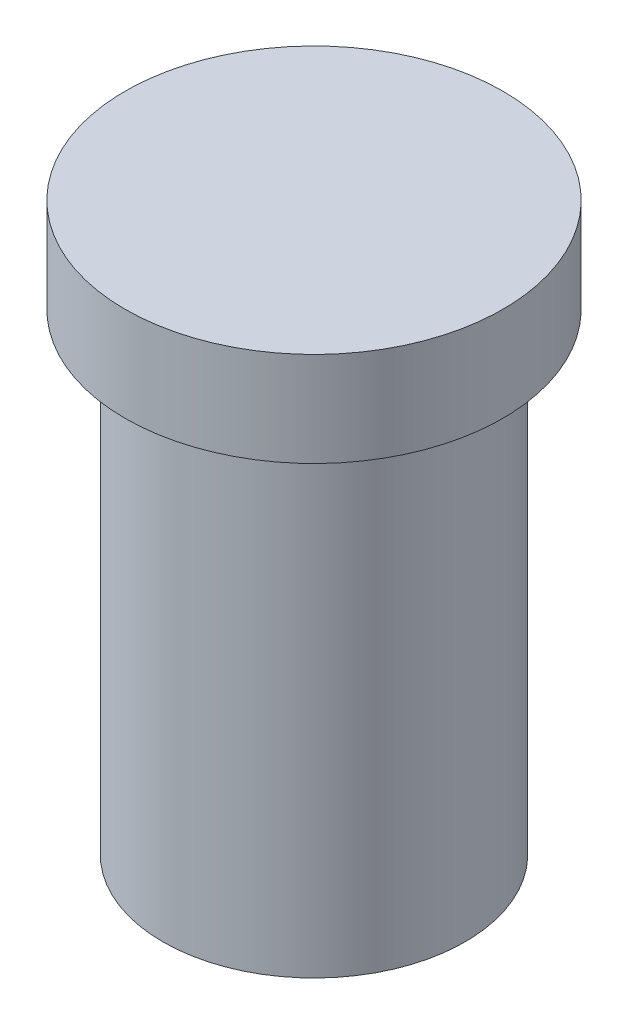
ISO-10303-21;
HEADER;
FILE_DESCRIPTION(('STEP AP214'),'2;1');
FILE_NAME('part.step','',(''),(''),'','','');
FILE_SCHEMA(('AUTOMOTIVE_DESIGN { 1 0 10303 214 1 1 1 1 }'));
ENDSEC;
DATA;
#1=APPLICATION_CONTEXT('core data for automotive mechanical design processes');
#2=APPLICATION_PROTOCOL_DEFINITION('international standard','automotive_design',2000,#1);
#3=PRODUCT_CONTEXT('',#1,'mechanical');
#4=PRODUCT('Part','Part','',(#3));
#5=PRODUCT_RELATED_PRODUCT_CATEGORY('part','',(#4));
#6=PRODUCT_DEFINITION_FORMATION('','',#4);
#7=PRODUCT_DEFINITION_CONTEXT('part definition',#1,'design');
#8=PRODUCT_DEFINITION('design','',#6,#7);
#9=PRODUCT_DEFINITION_SHAPE('','',#8);
#10=(LENGTH_UNIT() NAMED_UNIT(*) SI_UNIT(.MILLI.,.METRE.));
#11=(NAMED_UNIT(*) PLANE_ANGLE_UNIT() SI_UNIT($,.RADIAN.));
#12=(NAMED_UNIT(*) SI_UNIT($,.STERADIAN.) SOLID_ANGLE_UNIT());
#13=UNCERTAINTY_MEASURE_WITH_UNIT(LENGTH_MEASURE(1.E-05),#10,'distance_accuracy_value','');
#14=(GEOMETRIC_REPRESENTATION_CONTEXT(3) GLOBAL_UNCERTAINTY_ASSIGNED_CONTEXT((#13)) GLOBAL_UNIT_ASSIGNED_CONTEXT((#10,
#11,#12)) REPRESENTATION_CONTEXT('',''));
#15=CARTESIAN_POINT('',(0.,0.,0.));
#16=DIRECTION('',(0.,0.,1.));
#17=DIRECTION('',(1.,0.,0.));
#18=AXIS2_PLACEMENT_3D('',#15,#16,#17);
#19=CARTESIAN_POINT('',(0.,1250.,0.));
#20=DIRECTION('',(0.,-1.,0.));
#21=DIRECTION('',(0.,0.,-1.));
#22=AXIS2_PLACEMENT_3D('',#19,#20,#21);
#23=CYLINDRICAL_SURFACE('',#22,400.);
#24=CARTESIAN_POINT('',(0.,1250.,0.));
#25=DIRECTION('',(0.,1.,0.));
#26=DIRECTION('',(0.,0.,1.));
#27=AXIS2_PLACEMENT_3D('',#24,#25,#26);
#28=CIRCLE('',#27,400.);
#29=CARTESIAN_POINT('',(0.,1250.,400.));
#30=VERTEX_POINT('',#29);
#31=EDGE_CURVE('E10',#30,#30,#28,.T.);
#32=ORIENTED_EDGE('',*,*,#31,.F.);
#33=EDGE_LOOP('',(#32));
#34=FACE_BOUND('',#33,.T.);
#35=CARTESIAN_POINT('',(0.,0.,0.));
#36=DIRECTION('',(0.,1.,0.));
#37=DIRECTION('',(0.,0.,1.));
#38=AXIS2_PLACEMENT_3D('',#35,#36,#37);
#39=CIRCLE('',#38,400.);
#40=CARTESIAN_POINT('',(0.,0.,400.));
#41=VERTEX_POINT('',#40);
#42=EDGE_CURVE('E46',#41,#41,#39,.T.);
#43=ORIENTED_EDGE('',*,*,#42,.T.);
#44=EDGE_LOOP('',(#43));
#45=FACE_BOUND('',#44,.T.);
#46=ADVANCED_FACE('F43',(#34,#45),#23,.T.);
#47=CARTESIAN_POINT('',(0.,0.,0.));
#48=DIRECTION('',(0.,1.,0.));
#49=DIRECTION('',(0.,0.,1.));
#50=AXIS2_PLACEMENT_3D('',#47,#48,#49);
#51=PLANE('',#50);
#52=ORIENTED_EDGE('',*,*,#42,.F.);
#53=EDGE_LOOP('',(#52));
#54=FACE_BOUND('',#53,.T.);
#55=ADVANCED_FACE('F70',(#54),#51,.F.);
#56=CARTESIAN_POINT('',(0.,1500.,0.));
#57=DIRECTION('',(0.,-1.,0.));
#58=DIRECTION('',(0.,0.,-1.));
#59=AXIS2_PLACEMENT_3D('',#56,#57,#58);
#60=CYLINDRICAL_SURFACE('',#59,500.);
#61=CARTESIAN_POINT('',(0.,1500.,0.));
#62=DIRECTION('',(0.,1.,0.));
#63=DIRECTION('',(0.,0.,1.));
#64=AXIS2_PLACEMENT_3D('',#61,#62,#63);
#65=CIRCLE('',#64,500.);
#66=CARTESIAN_POINT('',(0.,1500.,500.));
#67=VERTEX_POINT('',#66);
#68=EDGE_CURVE('E55',#67,#67,#65,.T.);
#69=ORIENTED_EDGE('',*,*,#68,.F.);
#70=EDGE_LOOP('',(#69));
#71=FACE_BOUND('',#70,.T.);
#72=CARTESIAN_POINT('',(0.,1250.,0.));
#73=DIRECTION('',(0.,1.,0.));
#74=DIRECTION('',(0.,0.,1.));
#75=AXIS2_PLACEMENT_3D('',#72,#73,#74);
#76=CIRCLE('',#75,500.);
#77=CARTESIAN_POINT('',(0.,1250.,500.));
#78=VERTEX_POINT('',#77);
#79=EDGE_CURVE('E57',#78,#78,#76,.T.);
#80=ORIENTED_EDGE('',*,*,#79,.T.);
#81=EDGE_LOOP('',(#80));
#82=FACE_BOUND('',#81,.T.);
#83=ADVANCED_FACE('F67',(#71,#82),#60,.T.);
#84=CARTESIAN_POINT('',(0.,1500.,0.));
#85=DIRECTION('',(0.,1.,0.));
#86=DIRECTION('',(0.,0.,1.));
#87=AXIS2_PLACEMENT_3D('',#84,#85,#86);
#88=PLANE('',#87);
#89=ORIENTED_EDGE('',*,*,#68,.T.);
#90=EDGE_LOOP('',(#89));
#91=FACE_BOUND('',#90,.T.);
#92=ADVANCED_FACE('F65',(#91),#88,.T.);
#93=CARTESIAN_POINT('',(0.,1250.,0.));
#94=DIRECTION('',(0.,1.,0.));
#95=DIRECTION('',(0.,0.,1.));
#96=AXIS2_PLACEMENT_3D('',#93,#94,#95);
#97=PLANE('',#96);
#98=ORIENTED_EDGE('',*,*,#31,.T.);
#99=EDGE_LOOP('',(#98));
#100=FACE_BOUND('',#99,.T.);
#101=ORIENTED_EDGE('',*,*,#79,.F.);
#102=EDGE_LOOP('',(#101));
#103=FACE_BOUND('',#102,.T.);
#104=ADVANCED_FACE('F74',(#100,#103),#97,.F.);
#105=CLOSED_SHELL('',(#46,#55,#83,#92,#104));
#106=MANIFOLD_SOLID_BREP('B2',#105);
#107=ADVANCED_BREP_SHAPE_REPRESENTATION('',(#18,#106),#14);
#108=SHAPE_DEFINITION_REPRESENTATION(#9,#107);
ENDSEC;
END-ISO-10303-21;
